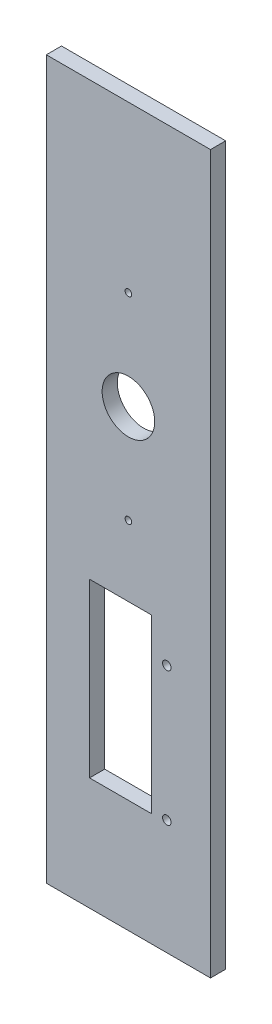
ISO-10303-21;
HEADER;
FILE_DESCRIPTION(('STEP AP214'),'2;1');
FILE_NAME('part.step','',(''),(''),'','','');
FILE_SCHEMA(('AUTOMOTIVE_DESIGN { 1 0 10303 214 1 1 1 1 }'));
ENDSEC;
DATA;
#1=APPLICATION_CONTEXT('core data for automotive mechanical design processes');
#2=APPLICATION_PROTOCOL_DEFINITION('international standard','automotive_design',2000,#1);
#3=PRODUCT_CONTEXT('',#1,'mechanical');
#4=PRODUCT('Part','Part','',(#3));
#5=PRODUCT_RELATED_PRODUCT_CATEGORY('part','',(#4));
#6=PRODUCT_DEFINITION_FORMATION('','',#4);
#7=PRODUCT_DEFINITION_CONTEXT('part definition',#1,'design');
#8=PRODUCT_DEFINITION('design','',#6,#7);
#9=PRODUCT_DEFINITION_SHAPE('','',#8);
#10=(LENGTH_UNIT() NAMED_UNIT(*) SI_UNIT(.MILLI.,.METRE.));
#11=(NAMED_UNIT(*) PLANE_ANGLE_UNIT() SI_UNIT($,.RADIAN.));
#12=(NAMED_UNIT(*) SI_UNIT($,.STERADIAN.) SOLID_ANGLE_UNIT());
#13=UNCERTAINTY_MEASURE_WITH_UNIT(LENGTH_MEASURE(1.E-05),#10,'distance_accuracy_value','');
#14=(GEOMETRIC_REPRESENTATION_CONTEXT(3) GLOBAL_UNCERTAINTY_ASSIGNED_CONTEXT((#13)) GLOBAL_UNIT_ASSIGNED_CONTEXT((#10,
#11,#12)) REPRESENTATION_CONTEXT('',''));
#15=CARTESIAN_POINT('',(0.,0.,0.));
#16=DIRECTION('',(0.,0.,1.));
#17=DIRECTION('',(1.,0.,0.));
#18=AXIS2_PLACEMENT_3D('',#15,#16,#17);
#19=CARTESIAN_POINT('',(0.,0.,6.35));
#20=DIRECTION('',(0.,0.,1.));
#21=DIRECTION('',(1.,0.,0.));
#22=AXIS2_PLACEMENT_3D('',#19,#20,#21);
#23=PLANE('',#22);
#24=CARTESIAN_POINT('',(34.35,-103.95,6.35));
#25=DIRECTION('',(0.,0.,1.));
#26=DIRECTION('',(1.,0.,0.));
#27=AXIS2_PLACEMENT_3D('',#24,#25,#26);
#28=CIRCLE('',#27,11.);
#29=CARTESIAN_POINT('',(45.35,-103.95,6.35));
#30=VERTEX_POINT('',#29);
#31=EDGE_CURVE('E150',#30,#30,#28,.T.);
#32=ORIENTED_EDGE('',*,*,#31,.F.);
#33=EDGE_LOOP('',(#32));
#34=FACE_BOUND('',#33,.T.);
#35=CARTESIAN_POINT('',(50.4128,-245.74,6.35));
#36=DIRECTION('',(0.,0.,1.));
#37=DIRECTION('',(1.,0.,0.));
#38=AXIS2_PLACEMENT_3D('',#35,#36,#37);
#39=CIRCLE('',#38,1.78593749999998);
#40=CARTESIAN_POINT('',(52.1987375,-245.74,6.35));
#41=VERTEX_POINT('',#40);
#42=EDGE_CURVE('E166',#41,#41,#39,.T.);
#43=ORIENTED_EDGE('',*,*,#42,.F.);
#44=EDGE_LOOP('',(#43));
#45=FACE_BOUND('',#44,.T.);
#46=DIRECTION('',(1.,0.,0.));
#47=VECTOR('',#46,1.);
#48=CARTESIAN_POINT('',(18.0878,-246.64,6.35));
#49=LINE('',#48,#47);
#50=CARTESIAN_POINT('',(18.0878,-246.64,6.35));
#51=VERTEX_POINT('',#50);
#52=CARTESIAN_POINT('',(44.0878,-246.64,6.35));
#53=VERTEX_POINT('',#52);
#54=EDGE_CURVE('E184',#51,#53,#49,.T.);
#55=ORIENTED_EDGE('',*,*,#54,.F.);
#56=DIRECTION('',(0.,-1.,0.));
#57=VECTOR('',#56,1.);
#58=CARTESIAN_POINT('',(18.0878,-174.64,6.35));
#59=LINE('',#58,#57);
#60=CARTESIAN_POINT('',(18.0878,-174.64,6.35));
#61=VERTEX_POINT('',#60);
#62=EDGE_CURVE('E181',#61,#51,#59,.T.);
#63=ORIENTED_EDGE('',*,*,#62,.F.);
#64=DIRECTION('',(-1.,0.,0.));
#65=VECTOR('',#64,1.);
#66=CARTESIAN_POINT('',(44.0878,-174.64,6.35));
#67=LINE('',#66,#65);
#68=CARTESIAN_POINT('',(44.0878,-174.64,6.35));
#69=VERTEX_POINT('',#68);
#70=EDGE_CURVE('E191',#69,#61,#67,.T.);
#71=ORIENTED_EDGE('',*,*,#70,.F.);
#72=DIRECTION('',(0.,1.,0.));
#73=VECTOR('',#72,1.);
#74=CARTESIAN_POINT('',(44.0878,-246.64,6.35));
#75=LINE('',#74,#73);
#76=EDGE_CURVE('E188',#53,#69,#75,.T.);
#77=ORIENTED_EDGE('',*,*,#76,.F.);
#78=EDGE_LOOP('',(#55,#63,#71,#77));
#79=FACE_BOUND('',#78,.T.);
#80=DIRECTION('',(0.,1.,0.));
#81=VECTOR('',#80,1.);
#82=CARTESIAN_POINT('',(68.7,-293.84,6.35));
#83=LINE('',#82,#81);
#84=CARTESIAN_POINT('',(68.7,-293.84,6.35));
#85=VERTEX_POINT('',#84);
#86=CARTESIAN_POINT('',(68.7,6.35,6.35));
#87=VERTEX_POINT('',#86);
#88=EDGE_CURVE('E217',#85,#87,#83,.T.);
#89=ORIENTED_EDGE('',*,*,#88,.T.);
#90=DIRECTION('',(1.,0.,0.));
#91=VECTOR('',#90,1.);
#92=CARTESIAN_POINT('',(0.,6.35,6.35));
#93=LINE('',#92,#91);
#94=CARTESIAN_POINT('',(0.,6.35,6.35));
#95=VERTEX_POINT('',#94);
#96=EDGE_CURVE('E133',#95,#87,#93,.T.);
#97=ORIENTED_EDGE('',*,*,#96,.F.);
#98=DIRECTION('',(0.,-1.,0.));
#99=VECTOR('',#98,1.);
#100=CARTESIAN_POINT('',(0.,-293.84,6.35));
#101=LINE('',#100,#99);
#102=CARTESIAN_POINT('',(0.,-293.84,6.35));
#103=VERTEX_POINT('',#102);
#104=EDGE_CURVE('E220',#95,#103,#101,.T.);
#105=ORIENTED_EDGE('',*,*,#104,.T.);
#106=DIRECTION('',(1.,0.,0.));
#107=VECTOR('',#106,1.);
#108=CARTESIAN_POINT('',(68.7,-293.84,6.35));
#109=LINE('',#108,#107);
#110=EDGE_CURVE('E224',#103,#85,#109,.T.);
#111=ORIENTED_EDGE('',*,*,#110,.T.);
#112=EDGE_LOOP('',(#89,#97,#105,#111));
#113=FACE_BOUND('',#112,.T.);
#114=CARTESIAN_POINT('',(50.4128,-189.74,6.35));
#115=DIRECTION('',(0.,0.,1.));
#116=DIRECTION('',(1.,0.,0.));
#117=AXIS2_PLACEMENT_3D('',#114,#115,#116);
#118=CIRCLE('',#117,1.78593749999998);
#119=CARTESIAN_POINT('',(52.1987375,-189.74,6.35));
#120=VERTEX_POINT('',#119);
#121=EDGE_CURVE('E174',#120,#120,#118,.T.);
#122=ORIENTED_EDGE('',*,*,#121,.F.);
#123=EDGE_LOOP('',(#122));
#124=FACE_BOUND('',#123,.T.);
#125=CARTESIAN_POINT('',(34.35,-145.2,6.35));
#126=DIRECTION('',(0.,0.,1.));
#127=DIRECTION('',(1.,0.,0.));
#128=AXIS2_PLACEMENT_3D('',#125,#126,#127);
#129=CIRCLE('',#128,1.38906249999999);
#130=CARTESIAN_POINT('',(35.7390625,-145.2,6.35));
#131=VERTEX_POINT('',#130);
#132=EDGE_CURVE('E158',#131,#131,#129,.T.);
#133=ORIENTED_EDGE('',*,*,#132,.F.);
#134=EDGE_LOOP('',(#133));
#135=FACE_BOUND('',#134,.T.);
#136=CARTESIAN_POINT('',(34.35,-62.7,6.35));
#137=DIRECTION('',(0.,0.,1.));
#138=DIRECTION('',(1.,0.,0.));
#139=AXIS2_PLACEMENT_3D('',#136,#137,#138);
#140=CIRCLE('',#139,1.3890625);
#141=CARTESIAN_POINT('',(35.7390625,-62.7,6.35));
#142=VERTEX_POINT('',#141);
#143=EDGE_CURVE('E142',#142,#142,#140,.T.);
#144=ORIENTED_EDGE('',*,*,#143,.F.);
#145=EDGE_LOOP('',(#144));
#146=FACE_BOUND('',#145,.T.);
#147=ADVANCED_FACE('F39',(#34,#45,#79,#113,#124,#135,#146),#23,.T.);
#148=CARTESIAN_POINT('',(0.,0.,0.));
#149=DIRECTION('',(0.,0.,1.));
#150=DIRECTION('',(1.,0.,0.));
#151=AXIS2_PLACEMENT_3D('',#148,#149,#150);
#152=PLANE('',#151);
#153=DIRECTION('',(0.,1.,0.));
#154=VECTOR('',#153,1.);
#155=CARTESIAN_POINT('',(68.7,-293.84,0.));
#156=LINE('',#155,#154);
#157=CARTESIAN_POINT('',(68.7,-293.84,0.));
#158=VERTEX_POINT('',#157);
#159=CARTESIAN_POINT('',(68.7,6.35,0.));
#160=VERTEX_POINT('',#159);
#161=EDGE_CURVE('E108',#158,#160,#156,.T.);
#162=ORIENTED_EDGE('',*,*,#161,.F.);
#163=DIRECTION('',(1.,0.,0.));
#164=VECTOR('',#163,1.);
#165=CARTESIAN_POINT('',(68.7,-293.84,0.));
#166=LINE('',#165,#164);
#167=CARTESIAN_POINT('',(0.,-293.84,0.));
#168=VERTEX_POINT('',#167);
#169=EDGE_CURVE('E221',#168,#158,#166,.T.);
#170=ORIENTED_EDGE('',*,*,#169,.F.);
#171=DIRECTION('',(0.,-1.,0.));
#172=VECTOR('',#171,1.);
#173=CARTESIAN_POINT('',(0.,-293.84,0.));
#174=LINE('',#173,#172);
#175=CARTESIAN_POINT('',(0.,6.35,0.));
#176=VERTEX_POINT('',#175);
#177=EDGE_CURVE('E117',#176,#168,#174,.T.);
#178=ORIENTED_EDGE('',*,*,#177,.F.);
#179=DIRECTION('',(-1.,0.,0.));
#180=VECTOR('',#179,1.);
#181=CARTESIAN_POINT('',(68.7,6.35,0.));
#182=LINE('',#181,#180);
#183=EDGE_CURVE('E121',#160,#176,#182,.T.);
#184=ORIENTED_EDGE('',*,*,#183,.F.);
#185=EDGE_LOOP('',(#162,#170,#178,#184));
#186=FACE_BOUND('',#185,.T.);
#187=DIRECTION('',(0.,-1.,0.));
#188=VECTOR('',#187,1.);
#189=CARTESIAN_POINT('',(18.0878,-174.64,0.));
#190=LINE('',#189,#188);
#191=CARTESIAN_POINT('',(18.0878,-174.64,0.));
#192=VERTEX_POINT('',#191);
#193=CARTESIAN_POINT('',(18.0878,-246.64,0.));
#194=VERTEX_POINT('',#193);
#195=EDGE_CURVE('E63',#192,#194,#190,.T.);
#196=ORIENTED_EDGE('',*,*,#195,.T.);
#197=DIRECTION('',(1.,0.,0.));
#198=VECTOR('',#197,1.);
#199=CARTESIAN_POINT('',(18.0878,-246.64,0.));
#200=LINE('',#199,#198);
#201=CARTESIAN_POINT('',(44.0878,-246.64,0.));
#202=VERTEX_POINT('',#201);
#203=EDGE_CURVE('E197',#194,#202,#200,.T.);
#204=ORIENTED_EDGE('',*,*,#203,.T.);
#205=DIRECTION('',(0.,1.,0.));
#206=VECTOR('',#205,1.);
#207=CARTESIAN_POINT('',(44.0878,-246.64,0.));
#208=LINE('',#207,#206);
#209=CARTESIAN_POINT('',(44.0878,-174.64,0.));
#210=VERTEX_POINT('',#209);
#211=EDGE_CURVE('E201',#202,#210,#208,.T.);
#212=ORIENTED_EDGE('',*,*,#211,.T.);
#213=DIRECTION('',(-1.,0.,0.));
#214=VECTOR('',#213,1.);
#215=CARTESIAN_POINT('',(44.0878,-174.64,0.));
#216=LINE('',#215,#214);
#217=EDGE_CURVE('E185',#210,#192,#216,.T.);
#218=ORIENTED_EDGE('',*,*,#217,.T.);
#219=EDGE_LOOP('',(#196,#204,#212,#218));
#220=FACE_BOUND('',#219,.T.);
#221=CARTESIAN_POINT('',(50.4128,-189.74,0.));
#222=DIRECTION('',(0.,0.,1.));
#223=DIRECTION('',(1.,0.,0.));
#224=AXIS2_PLACEMENT_3D('',#221,#222,#223);
#225=CIRCLE('',#224,1.78593749999998);
#226=CARTESIAN_POINT('',(52.1987375,-189.74,0.));
#227=VERTEX_POINT('',#226);
#228=EDGE_CURVE('E170',#227,#227,#225,.T.);
#229=ORIENTED_EDGE('',*,*,#228,.T.);
#230=EDGE_LOOP('',(#229));
#231=FACE_BOUND('',#230,.T.);
#232=CARTESIAN_POINT('',(50.4128,-245.74,0.));
#233=DIRECTION('',(0.,0.,1.));
#234=DIRECTION('',(1.,0.,0.));
#235=AXIS2_PLACEMENT_3D('',#232,#233,#234);
#236=CIRCLE('',#235,1.78593749999998);
#237=CARTESIAN_POINT('',(52.1987375,-245.74,0.));
#238=VERTEX_POINT('',#237);
#239=EDGE_CURVE('E162',#238,#238,#236,.T.);
#240=ORIENTED_EDGE('',*,*,#239,.T.);
#241=EDGE_LOOP('',(#240));
#242=FACE_BOUND('',#241,.T.);
#243=CARTESIAN_POINT('',(34.35,-145.2,0.));
#244=DIRECTION('',(0.,0.,1.));
#245=DIRECTION('',(1.,0.,0.));
#246=AXIS2_PLACEMENT_3D('',#243,#244,#245);
#247=CIRCLE('',#246,1.38906249999999);
#248=CARTESIAN_POINT('',(35.7390625,-145.2,0.));
#249=VERTEX_POINT('',#248);
#250=EDGE_CURVE('E154',#249,#249,#247,.T.);
#251=ORIENTED_EDGE('',*,*,#250,.T.);
#252=EDGE_LOOP('',(#251));
#253=FACE_BOUND('',#252,.T.);
#254=CARTESIAN_POINT('',(34.35,-103.95,0.));
#255=DIRECTION('',(0.,0.,1.));
#256=DIRECTION('',(1.,0.,0.));
#257=AXIS2_PLACEMENT_3D('',#254,#255,#256);
#258=CIRCLE('',#257,11.);
#259=CARTESIAN_POINT('',(45.35,-103.95,0.));
#260=VERTEX_POINT('',#259);
#261=EDGE_CURVE('E146',#260,#260,#258,.T.);
#262=ORIENTED_EDGE('',*,*,#261,.T.);
#263=EDGE_LOOP('',(#262));
#264=FACE_BOUND('',#263,.T.);
#265=CARTESIAN_POINT('',(34.35,-62.7,0.));
#266=DIRECTION('',(0.,0.,1.));
#267=DIRECTION('',(1.,0.,0.));
#268=AXIS2_PLACEMENT_3D('',#265,#266,#267);
#269=CIRCLE('',#268,1.3890625);
#270=CARTESIAN_POINT('',(35.7390625,-62.7,0.));
#271=VERTEX_POINT('',#270);
#272=EDGE_CURVE('E141',#271,#271,#269,.T.);
#273=ORIENTED_EDGE('',*,*,#272,.T.);
#274=EDGE_LOOP('',(#273));
#275=FACE_BOUND('',#274,.T.);
#276=ADVANCED_FACE('F122',(#186,#220,#231,#242,#253,#264,#275),#152,.F.);
#277=CARTESIAN_POINT('',(68.7,-293.84,6.35));
#278=DIRECTION('',(-1.,0.,0.));
#279=DIRECTION('',(0.,0.,1.));
#280=AXIS2_PLACEMENT_3D('',#277,#278,#279);
#281=PLANE('',#280);
#282=ORIENTED_EDGE('',*,*,#161,.T.);
#283=DIRECTION('',(0.,0.,-1.));
#284=VECTOR('',#283,1.);
#285=CARTESIAN_POINT('',(68.7,6.35,6.35));
#286=LINE('',#285,#284);
#287=EDGE_CURVE('E112',#87,#160,#286,.T.);
#288=ORIENTED_EDGE('',*,*,#287,.F.);
#289=ORIENTED_EDGE('',*,*,#88,.F.);
#290=DIRECTION('',(0.,0.,-1.));
#291=VECTOR('',#290,1.);
#292=CARTESIAN_POINT('',(68.7,-293.84,6.35));
#293=LINE('',#292,#291);
#294=EDGE_CURVE('E48',#85,#158,#293,.T.);
#295=ORIENTED_EDGE('',*,*,#294,.T.);
#296=EDGE_LOOP('',(#282,#288,#289,#295));
#297=FACE_BOUND('',#296,.T.);
#298=ADVANCED_FACE('F41',(#297),#281,.F.);
#299=CARTESIAN_POINT('',(0.,-293.84,6.35));
#300=DIRECTION('',(1.,0.,0.));
#301=DIRECTION('',(0.,0.,-1.));
#302=AXIS2_PLACEMENT_3D('',#299,#300,#301);
#303=PLANE('',#302);
#304=ORIENTED_EDGE('',*,*,#177,.T.);
#305=DIRECTION('',(0.,0.,-1.));
#306=VECTOR('',#305,1.);
#307=CARTESIAN_POINT('',(0.,-293.84,6.35));
#308=LINE('',#307,#306);
#309=EDGE_CURVE('E11',#103,#168,#308,.T.);
#310=ORIENTED_EDGE('',*,*,#309,.F.);
#311=ORIENTED_EDGE('',*,*,#104,.F.);
#312=DIRECTION('',(0.,0.,1.));
#313=VECTOR('',#312,1.);
#314=CARTESIAN_POINT('',(0.,6.35,0.));
#315=LINE('',#314,#313);
#316=EDGE_CURVE('E128',#176,#95,#315,.T.);
#317=ORIENTED_EDGE('',*,*,#316,.F.);
#318=EDGE_LOOP('',(#304,#310,#311,#317));
#319=FACE_BOUND('',#318,.T.);
#320=ADVANCED_FACE('F236',(#319),#303,.F.);
#321=CARTESIAN_POINT('',(68.7,-293.84,6.35));
#322=DIRECTION('',(0.,1.,0.));
#323=DIRECTION('',(0.,0.,1.));
#324=AXIS2_PLACEMENT_3D('',#321,#322,#323);
#325=PLANE('',#324);
#326=ORIENTED_EDGE('',*,*,#169,.T.);
#327=ORIENTED_EDGE('',*,*,#294,.F.);
#328=ORIENTED_EDGE('',*,*,#110,.F.);
#329=ORIENTED_EDGE('',*,*,#309,.T.);
#330=EDGE_LOOP('',(#326,#327,#328,#329));
#331=FACE_BOUND('',#330,.T.);
#332=ADVANCED_FACE('F232',(#331),#325,.F.);
#333=CARTESIAN_POINT('',(18.0878,-174.64,6.35));
#334=DIRECTION('',(1.,0.,0.));
#335=DIRECTION('',(0.,1.,0.));
#336=AXIS2_PLACEMENT_3D('',#333,#334,#335);
#337=PLANE('',#336);
#338=ORIENTED_EDGE('',*,*,#195,.F.);
#339=DIRECTION('',(0.,0.,-1.));
#340=VECTOR('',#339,1.);
#341=CARTESIAN_POINT('',(18.0878,-174.64,6.35));
#342=LINE('',#341,#340);
#343=EDGE_CURVE('E194',#61,#192,#342,.T.);
#344=ORIENTED_EDGE('',*,*,#343,.F.);
#345=ORIENTED_EDGE('',*,*,#62,.T.);
#346=DIRECTION('',(0.,0.,-1.));
#347=VECTOR('',#346,1.);
#348=CARTESIAN_POINT('',(18.0878,-246.64,6.35));
#349=LINE('',#348,#347);
#350=EDGE_CURVE('E118',#51,#194,#349,.T.);
#351=ORIENTED_EDGE('',*,*,#350,.T.);
#352=EDGE_LOOP('',(#338,#344,#345,#351));
#353=FACE_BOUND('',#352,.T.);
#354=ADVANCED_FACE('F263',(#353),#337,.T.);
#355=CARTESIAN_POINT('',(18.0878,-246.64,6.35));
#356=DIRECTION('',(0.,1.,0.));
#357=DIRECTION('',(0.,0.,1.));
#358=AXIS2_PLACEMENT_3D('',#355,#356,#357);
#359=PLANE('',#358);
#360=ORIENTED_EDGE('',*,*,#203,.F.);
#361=ORIENTED_EDGE('',*,*,#350,.F.);
#362=ORIENTED_EDGE('',*,*,#54,.T.);
#363=DIRECTION('',(0.,0.,-1.));
#364=VECTOR('',#363,1.);
#365=CARTESIAN_POINT('',(44.0878,-246.64,6.35));
#366=LINE('',#365,#364);
#367=EDGE_CURVE('E212',#53,#202,#366,.T.);
#368=ORIENTED_EDGE('',*,*,#367,.T.);
#369=EDGE_LOOP('',(#360,#361,#362,#368));
#370=FACE_BOUND('',#369,.T.);
#371=ADVANCED_FACE('F362',(#370),#359,.T.);
#372=CARTESIAN_POINT('',(44.0878,-246.64,6.35));
#373=DIRECTION('',(-1.,0.,0.));
#374=DIRECTION('',(0.,-1.,0.));
#375=AXIS2_PLACEMENT_3D('',#372,#373,#374);
#376=PLANE('',#375);
#377=ORIENTED_EDGE('',*,*,#211,.F.);
#378=ORIENTED_EDGE('',*,*,#367,.F.);
#379=ORIENTED_EDGE('',*,*,#76,.T.);
#380=DIRECTION('',(0.,0.,-1.));
#381=VECTOR('',#380,1.);
#382=CARTESIAN_POINT('',(44.0878,-174.64,6.35));
#383=LINE('',#382,#381);
#384=EDGE_CURVE('E55',#69,#210,#383,.T.);
#385=ORIENTED_EDGE('',*,*,#384,.T.);
#386=EDGE_LOOP('',(#377,#378,#379,#385));
#387=FACE_BOUND('',#386,.T.);
#388=ADVANCED_FACE('F354',(#387),#376,.T.);
#389=CARTESIAN_POINT('',(44.0878,-174.64,6.35));
#390=DIRECTION('',(0.,-1.,0.));
#391=DIRECTION('',(0.,0.,-1.));
#392=AXIS2_PLACEMENT_3D('',#389,#390,#391);
#393=PLANE('',#392);
#394=ORIENTED_EDGE('',*,*,#217,.F.);
#395=ORIENTED_EDGE('',*,*,#384,.F.);
#396=ORIENTED_EDGE('',*,*,#70,.T.);
#397=ORIENTED_EDGE('',*,*,#343,.T.);
#398=EDGE_LOOP('',(#394,#395,#396,#397));
#399=FACE_BOUND('',#398,.T.);
#400=ADVANCED_FACE('F345',(#399),#393,.T.);
#401=CARTESIAN_POINT('',(50.4128,-189.74,6.35));
#402=DIRECTION('',(0.,0.,-1.));
#403=DIRECTION('',(-1.,0.,0.));
#404=AXIS2_PLACEMENT_3D('',#401,#402,#403);
#405=CYLINDRICAL_SURFACE('',#404,1.78593749999998);
#406=ORIENTED_EDGE('',*,*,#121,.T.);
#407=EDGE_LOOP('',(#406));
#408=FACE_BOUND('',#407,.T.);
#409=ORIENTED_EDGE('',*,*,#228,.F.);
#410=EDGE_LOOP('',(#409));
#411=FACE_BOUND('',#410,.T.);
#412=ADVANCED_FACE('F336',(#408,#411),#405,.F.);
#413=CARTESIAN_POINT('',(50.4128,-245.74,6.35));
#414=DIRECTION('',(0.,0.,-1.));
#415=DIRECTION('',(-1.,0.,0.));
#416=AXIS2_PLACEMENT_3D('',#413,#414,#415);
#417=CYLINDRICAL_SURFACE('',#416,1.78593749999998);
#418=ORIENTED_EDGE('',*,*,#42,.T.);
#419=EDGE_LOOP('',(#418));
#420=FACE_BOUND('',#419,.T.);
#421=ORIENTED_EDGE('',*,*,#239,.F.);
#422=EDGE_LOOP('',(#421));
#423=FACE_BOUND('',#422,.T.);
#424=ADVANCED_FACE('F327',(#420,#423),#417,.F.);
#425=CARTESIAN_POINT('',(34.35,-145.2,6.35));
#426=DIRECTION('',(0.,0.,-1.));
#427=DIRECTION('',(-1.,0.,0.));
#428=AXIS2_PLACEMENT_3D('',#425,#426,#427);
#429=CYLINDRICAL_SURFACE('',#428,1.38906249999999);
#430=ORIENTED_EDGE('',*,*,#132,.T.);
#431=EDGE_LOOP('',(#430));
#432=FACE_BOUND('',#431,.T.);
#433=ORIENTED_EDGE('',*,*,#250,.F.);
#434=EDGE_LOOP('',(#433));
#435=FACE_BOUND('',#434,.T.);
#436=ADVANCED_FACE('F318',(#432,#435),#429,.F.);
#437=CARTESIAN_POINT('',(34.35,-103.95,6.35));
#438=DIRECTION('',(0.,0.,-1.));
#439=DIRECTION('',(-1.,0.,0.));
#440=AXIS2_PLACEMENT_3D('',#437,#438,#439);
#441=CYLINDRICAL_SURFACE('',#440,11.);
#442=ORIENTED_EDGE('',*,*,#31,.T.);
#443=EDGE_LOOP('',(#442));
#444=FACE_BOUND('',#443,.T.);
#445=ORIENTED_EDGE('',*,*,#261,.F.);
#446=EDGE_LOOP('',(#445));
#447=FACE_BOUND('',#446,.T.);
#448=ADVANCED_FACE('F251',(#444,#447),#441,.F.);
#449=CARTESIAN_POINT('',(34.35,-62.7,6.35));
#450=DIRECTION('',(0.,0.,-1.));
#451=DIRECTION('',(-1.,0.,0.));
#452=AXIS2_PLACEMENT_3D('',#449,#450,#451);
#453=CYLINDRICAL_SURFACE('',#452,1.3890625);
#454=ORIENTED_EDGE('',*,*,#143,.T.);
#455=EDGE_LOOP('',(#454));
#456=FACE_BOUND('',#455,.T.);
#457=ORIENTED_EDGE('',*,*,#272,.F.);
#458=EDGE_LOOP('',(#457));
#459=FACE_BOUND('',#458,.T.);
#460=ADVANCED_FACE('F248',(#456,#459),#453,.F.);
#461=CARTESIAN_POINT('',(0.,6.35,0.));
#462=DIRECTION('',(0.,1.,0.));
#463=DIRECTION('',(0.,0.,1.));
#464=AXIS2_PLACEMENT_3D('',#461,#462,#463);
#465=PLANE('',#464);
#466=ORIENTED_EDGE('',*,*,#287,.T.);
#467=ORIENTED_EDGE('',*,*,#183,.T.);
#468=ORIENTED_EDGE('',*,*,#316,.T.);
#469=ORIENTED_EDGE('',*,*,#96,.T.);
#470=EDGE_LOOP('',(#466,#467,#468,#469));
#471=FACE_BOUND('',#470,.T.);
#472=ADVANCED_FACE('F131',(#471),#465,.T.);
#473=CLOSED_SHELL('',(#147,#276,#298,#320,#332,#354,#371,#388,#400,#412,#424,#436,#448,#460,#472));
#474=MANIFOLD_SOLID_BREP('B2',#473);
#475=ADVANCED_BREP_SHAPE_REPRESENTATION('',(#18,#474),#14);
#476=SHAPE_DEFINITION_REPRESENTATION(#9,#475);
ENDSEC;
END-ISO-10303-21;
